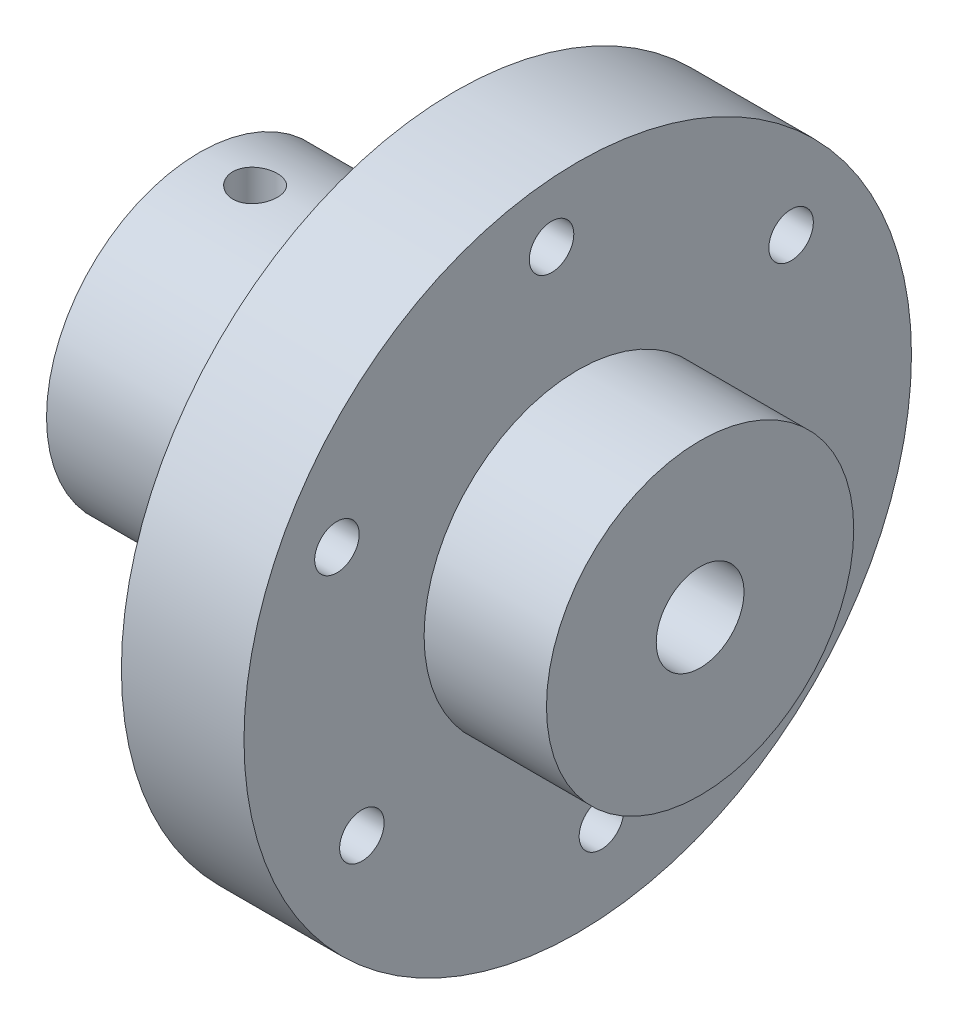
ISO-10303-21;
HEADER;
FILE_DESCRIPTION(('STEP AP214'),'2;1');
FILE_NAME('part.step','',(''),(''),'','','');
FILE_SCHEMA(('AUTOMOTIVE_DESIGN { 1 0 10303 214 1 1 1 1 }'));
ENDSEC;
DATA;
#1=APPLICATION_CONTEXT('core data for automotive mechanical design processes');
#2=APPLICATION_PROTOCOL_DEFINITION('international standard','automotive_design',2000,#1);
#3=PRODUCT_CONTEXT('',#1,'mechanical');
#4=PRODUCT('Part','Part','',(#3));
#5=PRODUCT_RELATED_PRODUCT_CATEGORY('part','',(#4));
#6=PRODUCT_DEFINITION_FORMATION('','',#4);
#7=PRODUCT_DEFINITION_CONTEXT('part definition',#1,'design');
#8=PRODUCT_DEFINITION('design','',#6,#7);
#9=PRODUCT_DEFINITION_SHAPE('','',#8);
#10=(LENGTH_UNIT() NAMED_UNIT(*) SI_UNIT(.MILLI.,.METRE.));
#11=(NAMED_UNIT(*) PLANE_ANGLE_UNIT() SI_UNIT($,.RADIAN.));
#12=(NAMED_UNIT(*) SI_UNIT($,.STERADIAN.) SOLID_ANGLE_UNIT());
#13=UNCERTAINTY_MEASURE_WITH_UNIT(LENGTH_MEASURE(1.E-05),#10,'distance_accuracy_value','');
#14=(GEOMETRIC_REPRESENTATION_CONTEXT(3) GLOBAL_UNCERTAINTY_ASSIGNED_CONTEXT((#13)) GLOBAL_UNIT_ASSIGNED_CONTEXT((#10,
#11,#12)) REPRESENTATION_CONTEXT('',''));
#15=CARTESIAN_POINT('',(0.,0.,0.));
#16=DIRECTION('',(0.,0.,1.));
#17=DIRECTION('',(1.,0.,0.));
#18=AXIS2_PLACEMENT_3D('',#15,#16,#17);
#19=CARTESIAN_POINT('',(0.,0.,0.));
#20=DIRECTION('',(1.,0.,0.));
#21=DIRECTION('',(0.,0.,-1.));
#22=AXIS2_PLACEMENT_3D('',#19,#20,#21);
#23=PLANE('',#22);
#24=CARTESIAN_POINT('',(0.,0.,0.));
#25=DIRECTION('',(1.,0.,0.));
#26=DIRECTION('',(0.,0.,-1.));
#27=AXIS2_PLACEMENT_3D('',#24,#25,#26);
#28=CIRCLE('',#27,13.75);
#29=CARTESIAN_POINT('',(0.,0.,-13.75));
#30=VERTEX_POINT('',#29);
#31=EDGE_CURVE('E168',#30,#30,#28,.T.);
#32=ORIENTED_EDGE('',*,*,#31,.F.);
#33=EDGE_LOOP('',(#32));
#34=FACE_BOUND('',#33,.T.);
#35=CARTESIAN_POINT('',(0.,0.,0.));
#36=DIRECTION('',(1.,0.,0.));
#37=DIRECTION('',(0.,0.,-1.));
#38=AXIS2_PLACEMENT_3D('',#35,#36,#37);
#39=CIRCLE('',#38,6.);
#40=CARTESIAN_POINT('',(0.,5.6479531690693,2.025));
#41=VERTEX_POINT('',#40);
#42=CARTESIAN_POINT('',(0.,5.6479531690693,-2.025));
#43=VERTEX_POINT('',#42);
#44=EDGE_CURVE('E165',#41,#43,#39,.T.);
#45=ORIENTED_EDGE('',*,*,#44,.T.);
#46=DIRECTION('',(0.,-1.,0.));
#47=VECTOR('',#46,1.);
#48=CARTESIAN_POINT('',(0.,3.85,-2.025));
#49=LINE('',#48,#47);
#50=CARTESIAN_POINT('',(0.,8.15,-2.025));
#51=VERTEX_POINT('',#50);
#52=EDGE_CURVE('E107',#51,#43,#49,.T.);
#53=ORIENTED_EDGE('',*,*,#52,.F.);
#54=DIRECTION('',(0.,0.,-1.));
#55=VECTOR('',#54,1.);
#56=CARTESIAN_POINT('',(0.,8.15,2.025));
#57=LINE('',#56,#55);
#58=CARTESIAN_POINT('',(0.,8.15,2.025));
#59=VERTEX_POINT('',#58);
#60=EDGE_CURVE('E111',#59,#51,#57,.T.);
#61=ORIENTED_EDGE('',*,*,#60,.F.);
#62=DIRECTION('',(0.,1.,0.));
#63=VECTOR('',#62,1.);
#64=CARTESIAN_POINT('',(0.,3.85,2.025));
#65=LINE('',#64,#63);
#66=EDGE_CURVE('E97',#41,#59,#65,.T.);
#67=ORIENTED_EDGE('',*,*,#66,.F.);
#68=EDGE_LOOP('',(#45,#53,#61,#67));
#69=FACE_BOUND('',#68,.T.);
#70=ADVANCED_FACE('F46',(#34,#69),#23,.F.);
#71=CARTESIAN_POINT('',(12.,0.,0.));
#72=DIRECTION('',(-1.,0.,0.));
#73=DIRECTION('',(0.,0.,1.));
#74=AXIS2_PLACEMENT_3D('',#71,#72,#73);
#75=CYLINDRICAL_SURFACE('',#74,13.75);
#76=CARTESIAN_POINT('',(5.,13.6037678604128,-1.99999999999999));
#77=CARTESIAN_POINT('',(5.11170147451788,13.6037696828469,-1.99999535765153));
#78=CARTESIAN_POINT('',(5.22346876317593,13.6051585235322,-1.99061045402892));
#79=CARTESIAN_POINT('',(5.44388126027463,13.610560390175,-1.9533271700691));
#80=CARTESIAN_POINT('',(5.55252327013628,13.614576011285,-1.92541048067569));
#81=CARTESIAN_POINT('',(5.76346273426917,13.6247672106777,-1.85191408162581));
#82=CARTESIAN_POINT('',(5.8657648809695,13.6309411684424,-1.80634762097099));
#83=CARTESIAN_POINT('',(6.06125576556668,13.6447514639797,-1.69887582800238));
#84=CARTESIAN_POINT('',(6.15444581428903,13.6523875909421,-1.63697285053975));
#85=CARTESIAN_POINT('',(6.32978470161016,13.6683261760088,-1.49808684531119));
#86=CARTESIAN_POINT('',(6.41185492507913,13.6766327766434,-1.42100503184549));
#87=CARTESIAN_POINT('',(6.56194363847952,13.692939341013,-1.25416264578909));
#88=CARTESIAN_POINT('',(6.62996137057535,13.7009392881916,-1.16440138984915));
#89=CARTESIAN_POINT('',(6.75030296803682,13.715774351691,-0.97424613739998));
#90=CARTESIAN_POINT('',(6.80255465914858,13.7226040510381,-0.873806006100216));
#91=CARTESIAN_POINT('',(6.88941795276066,13.7342832774787,-0.665459478823007));
#92=CARTESIAN_POINT('',(6.92403043291188,13.7391329030898,-0.557553454619606));
#93=CARTESIAN_POINT('',(6.97439507307044,13.7462763438899,-0.338146948151333));
#94=CARTESIAN_POINT('',(6.99027872984306,13.7485879705999,-0.226677240162861));
#95=CARTESIAN_POINT('',(7.00314299966664,13.7504559602361,-0.00263235495397235));
#96=CARTESIAN_POINT('',(7.00012460375964,13.7500124676143,0.109942764000325));
#97=CARTESIAN_POINT('',(6.97537453464449,13.7464344541793,0.332106213349457));
#98=CARTESIAN_POINT('',(6.95378432135685,13.7433202762861,0.441710677114486));
#99=CARTESIAN_POINT('',(6.89272535268884,13.7347734835498,0.655724208207438));
#100=CARTESIAN_POINT('',(6.85325615970269,13.7293408119595,0.760133148300332));
#101=CARTESIAN_POINT('',(6.75741371072513,13.7167324401517,0.961221913555114));
#102=CARTESIAN_POINT('',(6.70098057923809,13.7095505833803,1.05787279927888));
#103=CARTESIAN_POINT('',(6.57285586457755,13.6942448666419,1.24038631129748));
#104=CARTESIAN_POINT('',(6.5011633361525,13.6861209483325,1.3262482687421));
#105=CARTESIAN_POINT('',(6.34376603137261,13.6697490406875,1.48557995150401));
#106=CARTESIAN_POINT('',(6.25793778872673,13.6615005987712,1.55892771622801));
#107=CARTESIAN_POINT('',(6.07512578282357,13.6458827551655,1.69019745389173));
#108=CARTESIAN_POINT('',(5.97814195841379,13.6385133582954,1.74811934226432));
#109=CARTESIAN_POINT('',(5.77564828997558,13.6254881867745,1.84690774655302));
#110=CARTESIAN_POINT('',(5.67013251177874,13.6198336180394,1.88776226780074));
#111=CARTESIAN_POINT('',(5.4536366654301,13.6109000699534,1.95113638111024));
#112=CARTESIAN_POINT('',(5.34265695881667,13.6076209336494,1.97365718455691));
#113=CARTESIAN_POINT('',(5.11946711009801,13.6038391074986,1.99955843933568));
#114=CARTESIAN_POINT('',(5.00727741254296,13.6033113756213,2.00311153325653));
#115=CARTESIAN_POINT('',(4.78390419456717,13.605025676654,1.99143410784289));
#116=CARTESIAN_POINT('',(4.6727206449459,13.6072676289206,1.97620413540481));
#117=CARTESIAN_POINT('',(4.45504724747672,13.6142457139645,1.92753912095452));
#118=CARTESIAN_POINT('',(4.34853786703675,13.6189701240093,1.89418961854082));
#119=CARTESIAN_POINT('',(4.14262119152552,13.6303711708037,1.81032101224159));
#120=CARTESIAN_POINT('',(4.04321422810544,13.6370478986438,1.75980110720817));
#121=CARTESIAN_POINT('',(3.85354887459304,13.6516604770362,1.64260909382075));
#122=CARTESIAN_POINT('',(3.76336038729032,13.6596049238185,1.57582494389196));
#123=CARTESIAN_POINT('',(3.59540964992341,13.6758317056166,1.42815646147857));
#124=CARTESIAN_POINT('',(3.51764805972212,13.6841140585458,1.3472713807171));
#125=CARTESIAN_POINT('',(3.37614110931465,13.7001614515876,1.1729379394311));
#126=CARTESIAN_POINT('',(3.31250997540891,13.7079219456001,1.07939638120609));
#127=CARTESIAN_POINT('',(3.2018649493579,13.7219811196637,0.88285177714745));
#128=CARTESIAN_POINT('',(3.15485062496657,13.728279837738,0.779848977512918));
#129=CARTESIAN_POINT('',(3.07895749320421,13.7386857998428,0.567666837304545));
#130=CARTESIAN_POINT('',(3.05001554129796,13.742800666558,0.458510471781471));
#131=CARTESIAN_POINT('',(3.01088413075408,13.7484072260598,0.236822978136382));
#132=CARTESIAN_POINT('',(3.00069351066479,13.7498990813147,0.124292059471958));
#133=CARTESIAN_POINT('',(2.99938108993855,13.750090067362,-0.0998409077402447));
#134=CARTESIAN_POINT('',(3.00808425562929,13.7488148327678,-0.211441949207724));
#135=CARTESIAN_POINT('',(3.04393804943317,13.7436664644928,-0.43157602898444));
#136=CARTESIAN_POINT('',(3.07108862859001,13.7397933377064,-0.540109075434817));
#137=CARTESIAN_POINT('',(3.14300579441946,13.729882325212,-0.750983084659951));
#138=CARTESIAN_POINT('',(3.18776097767431,13.7238458410478,-0.853328006392702));
#139=CARTESIAN_POINT('',(3.29359839880605,13.7102721845597,-1.04908313807523));
#140=CARTESIAN_POINT('',(3.35468110272393,13.7027349694016,-1.14249309288839));
#141=CARTESIAN_POINT('',(3.49207556407473,13.6869153274344,-1.31861589391601));
#142=CARTESIAN_POINT('',(3.56851678883439,13.6786269185731,-1.40122721328146));
#143=CARTESIAN_POINT('',(3.73418621462435,13.6622840226442,-1.55251429750272));
#144=CARTESIAN_POINT('',(3.82341741628073,13.6542295910041,-1.62118678304169));
#145=CARTESIAN_POINT('',(4.01268413794728,13.6392212044936,-1.74296896599118));
#146=CARTESIAN_POINT('',(4.11277405500097,13.6322732651998,-1.79599484512113));
#147=CARTESIAN_POINT('',(4.32049135629694,13.6203350006855,-1.8844049661145));
#148=CARTESIAN_POINT('',(4.4281107090953,13.6153426259364,-1.91980768851834));
#149=CARTESIAN_POINT('',(4.61352373508644,13.6090457382165,-1.96384515631822));
#150=CARTESIAN_POINT('',(4.69016709723434,13.6070769015305,-1.97738272598922));
#151=CARTESIAN_POINT('',(4.84452968570156,13.604437336021,-1.99546171045602));
#152=CARTESIAN_POINT('',(4.92224889932033,13.6037665918865,-2.00000323136022));
#153=CARTESIAN_POINT('',(5.,13.6037678604128,-1.99999999999999));
#154=B_SPLINE_CURVE_WITH_KNOTS('',3,(#76,#77,#78,#79,#80,#81,#82,#83,#84,#85,#86,#87,#88,#89,
#90,#91,#92,#93,#94,#95,#96,#97,#98,#99,#100,#101,#102,#103,#104,#105,#106,#107,#108,#109,#110,
#111,#112,#113,#114,#115,#116,#117,#118,#119,#120,#121,#122,#123,#124,#125,#126,#127,#128,#129,
#130,#131,#132,#133,#134,#135,#136,#137,#138,#139,#140,#141,#142,#143,#144,#145,#146,#147,#148,
#149,#150,#151,#152,#153),.UNSPECIFIED.,.T.,.F.,(4,2,2,2,2,2,2,2,2,2,2,2,2,2,2,2,2,2,2,2,2,2,2,
2,2,2,2,2,2,2,2,2,2,2,2,2,2,2,4),(0.,0.334820265461425,0.669971820365651,1.0048722759916,
1.33972448324323,1.67683261336208,2.01395891861318,2.35260589974261,2.69123602961625,
3.02747417523753,3.36369469190864,3.69737669670612,4.03106686914349,4.36594893825537,
4.70085175785742,5.03885209035524,5.3768542757868,5.71509360567117,6.05331058486369,
6.3884438245952,6.72356730666316,7.05712229576474,7.39069285023051,7.72662975962056,
8.06258450119352,8.40116341082852,8.7397335125052,9.07711393835331,9.4144734662594,
9.74872101259892,10.0829676719057,10.4169981778597,10.7510382191581,11.0880221059806,
11.4250851815885,11.7639224096614,12.102403563257,12.3354618227143,12.5685173332333),.UNSPECIFIED.);
#155=CARTESIAN_POINT('',(5.,13.6037678604128,-1.99999999999999));
#156=VERTEX_POINT('',#155);
#157=EDGE_CURVE('E109',#156,#156,#154,.T.);
#158=ORIENTED_EDGE('',*,*,#157,.T.);
#159=EDGE_LOOP('',(#158));
#160=FACE_BOUND('',#159,.T.);
#161=ORIENTED_EDGE('',*,*,#31,.T.);
#162=EDGE_LOOP('',(#161));
#163=FACE_BOUND('',#162,.T.);
#164=CARTESIAN_POINT('',(22.98,0.,0.));
#165=DIRECTION('',(1.,0.,0.));
#166=DIRECTION('',(0.,0.,-1.));
#167=AXIS2_PLACEMENT_3D('',#164,#165,#166);
#168=CIRCLE('',#167,13.75);
#169=CARTESIAN_POINT('',(22.98,0.,-13.75));
#170=VERTEX_POINT('',#169);
#171=EDGE_CURVE('E156',#170,#170,#168,.T.);
#172=ORIENTED_EDGE('',*,*,#171,.F.);
#173=EDGE_LOOP('',(#172));
#174=FACE_BOUND('',#173,.T.);
#175=ADVANCED_FACE('F48',(#160,#163,#174),#75,.T.);
#176=CARTESIAN_POINT('',(12.,0.,0.));
#177=DIRECTION('',(-1.,0.,0.));
#178=DIRECTION('',(0.,0.,1.));
#179=AXIS2_PLACEMENT_3D('',#176,#177,#178);
#180=CYLINDRICAL_SURFACE('',#179,6.);
#181=DIRECTION('',(-1.,0.,0.));
#182=VECTOR('',#181,1.);
#183=CARTESIAN_POINT('',(12.,5.6479531690693,-2.025));
#184=LINE('',#183,#182);
#185=CARTESIAN_POINT('',(10.,5.6479531690693,-2.025));
#186=VERTEX_POINT('',#185);
#187=EDGE_CURVE('E55',#43,#186,#184,.F.);
#188=ORIENTED_EDGE('',*,*,#187,.F.);
#189=ORIENTED_EDGE('',*,*,#44,.F.);
#190=DIRECTION('',(-1.,0.,0.));
#191=VECTOR('',#190,1.);
#192=CARTESIAN_POINT('',(12.,5.6479531690693,2.025));
#193=LINE('',#192,#191);
#194=CARTESIAN_POINT('',(10.,5.6479531690693,2.025));
#195=VERTEX_POINT('',#194);
#196=EDGE_CURVE('E172',#195,#41,#193,.T.);
#197=ORIENTED_EDGE('',*,*,#196,.F.);
#198=CARTESIAN_POINT('',(10.,0.,0.));
#199=DIRECTION('',(-1.,0.,0.));
#200=DIRECTION('',(0.,0.,1.));
#201=AXIS2_PLACEMENT_3D('',#198,#199,#200);
#202=CIRCLE('',#201,6.);
#203=EDGE_CURVE('E67',#195,#186,#202,.T.);
#204=ORIENTED_EDGE('',*,*,#203,.T.);
#205=EDGE_LOOP('',(#188,#189,#197,#204));
#206=FACE_BOUND('',#205,.T.);
#207=CARTESIAN_POINT('',(12.,0.,0.));
#208=DIRECTION('',(1.,0.,0.));
#209=DIRECTION('',(0.,0.,-1.));
#210=AXIS2_PLACEMENT_3D('',#207,#208,#209);
#211=CIRCLE('',#210,6.);
#212=CARTESIAN_POINT('',(12.,0.,-6.));
#213=VERTEX_POINT('',#212);
#214=EDGE_CURVE('E162',#213,#213,#211,.T.);
#215=ORIENTED_EDGE('',*,*,#214,.T.);
#216=EDGE_LOOP('',(#215));
#217=FACE_BOUND('',#216,.T.);
#218=ADVANCED_FACE('F239',(#206,#217),#180,.F.);
#219=CARTESIAN_POINT('',(12.,0.,0.));
#220=DIRECTION('',(1.,0.,0.));
#221=DIRECTION('',(0.,0.,-1.));
#222=AXIS2_PLACEMENT_3D('',#219,#220,#221);
#223=PLANE('',#222);
#224=CARTESIAN_POINT('',(12.,0.,0.));
#225=DIRECTION('',(1.,0.,0.));
#226=DIRECTION('',(0.,0.,-1.));
#227=AXIS2_PLACEMENT_3D('',#224,#225,#226);
#228=CIRCLE('',#227,4.01);
#229=CARTESIAN_POINT('',(12.,0.,-4.01));
#230=VERTEX_POINT('',#229);
#231=EDGE_CURVE('E159',#230,#230,#228,.T.);
#232=ORIENTED_EDGE('',*,*,#231,.T.);
#233=EDGE_LOOP('',(#232));
#234=FACE_BOUND('',#233,.T.);
#235=ORIENTED_EDGE('',*,*,#214,.F.);
#236=EDGE_LOOP('',(#235));
#237=FACE_BOUND('',#236,.T.);
#238=ADVANCED_FACE('F236',(#234,#237),#223,.F.);
#239=CARTESIAN_POINT('',(61.8708729652601,0.,0.));
#240=DIRECTION('',(-1.,0.,0.));
#241=DIRECTION('',(0.,0.,1.));
#242=AXIS2_PLACEMENT_3D('',#239,#240,#241);
#243=CYLINDRICAL_SURFACE('',#242,4.01);
#244=ORIENTED_EDGE('',*,*,#231,.F.);
#245=EDGE_LOOP('',(#244));
#246=FACE_BOUND('',#245,.T.);
#247=CARTESIAN_POINT('',(34.,0.,0.));
#248=DIRECTION('',(1.,0.,0.));
#249=DIRECTION('',(0.,0.,-1.));
#250=AXIS2_PLACEMENT_3D('',#247,#248,#249);
#251=CIRCLE('',#250,4.01);
#252=CARTESIAN_POINT('',(34.,0.,-4.00999999999999));
#253=VERTEX_POINT('',#252);
#254=EDGE_CURVE('E261',#253,#253,#251,.T.);
#255=ORIENTED_EDGE('',*,*,#254,.T.);
#256=EDGE_LOOP('',(#255));
#257=FACE_BOUND('',#256,.T.);
#258=ADVANCED_FACE('F231',(#246,#257),#243,.F.);
#259=CARTESIAN_POINT('',(22.98,0.,0.));
#260=DIRECTION('',(1.,0.,0.));
#261=DIRECTION('',(0.,0.,-1.));
#262=AXIS2_PLACEMENT_3D('',#259,#260,#261);
#263=PLANE('',#262);
#264=CARTESIAN_POINT('',(22.98,10.843162234399,21.6436703131126));
#265=DIRECTION('',(1.,0.,0.));
#266=DIRECTION('',(0.,0.,-1.));
#267=AXIS2_PLACEMENT_3D('',#264,#265,#266);
#268=CIRCLE('',#267,1.99999999999999);
#269=CARTESIAN_POINT('',(22.98,10.843162234399,19.6436703131126));
#270=VERTEX_POINT('',#269);
#271=EDGE_CURVE('E117',#270,#270,#268,.T.);
#272=ORIENTED_EDGE('',*,*,#271,.T.);
#273=EDGE_LOOP('',(#272));
#274=FACE_BOUND('',#273,.T.);
#275=CARTESIAN_POINT('',(22.98,24.5683812365847,2.35315481087573));
#276=DIRECTION('',(1.,0.,0.));
#277=DIRECTION('',(0.,0.,-1.));
#278=AXIS2_PLACEMENT_3D('',#275,#276,#277);
#279=CIRCLE('',#278,1.99999999999999);
#280=CARTESIAN_POINT('',(22.98,24.5683812365847,0.353154810875743));
#281=VERTEX_POINT('',#280);
#282=EDGE_CURVE('E123',#281,#281,#279,.T.);
#283=ORIENTED_EDGE('',*,*,#282,.T.);
#284=EDGE_LOOP('',(#283));
#285=FACE_BOUND('',#284,.T.);
#286=CARTESIAN_POINT('',(22.98,14.724914260643,-19.1784912686404));
#287=DIRECTION('',(1.,0.,0.));
#288=DIRECTION('',(0.,0.,-1.));
#289=AXIS2_PLACEMENT_3D('',#286,#287,#288);
#290=CIRCLE('',#289,1.99999999999999);
#291=CARTESIAN_POINT('',(22.98,14.724914260643,-21.1784912686404));
#292=VERTEX_POINT('',#291);
#293=EDGE_CURVE('E129',#292,#292,#290,.T.);
#294=ORIENTED_EDGE('',*,*,#293,.T.);
#295=EDGE_LOOP('',(#294));
#296=FACE_BOUND('',#295,.T.);
#297=CARTESIAN_POINT('',(22.98,-8.84377171748452,-21.4196218459198));
#298=DIRECTION('',(1.,0.,0.));
#299=DIRECTION('',(0.,0.,-1.));
#300=AXIS2_PLACEMENT_3D('',#297,#298,#299);
#301=CIRCLE('',#300,1.99999999999999);
#302=CARTESIAN_POINT('',(22.98,-8.84377171748452,-23.4196218459198));
#303=VERTEX_POINT('',#302);
#304=EDGE_CURVE('E135',#303,#303,#301,.T.);
#305=ORIENTED_EDGE('',*,*,#304,.T.);
#306=EDGE_LOOP('',(#305));
#307=FACE_BOUND('',#306,.T.);
#308=CARTESIAN_POINT('',(22.98,-12.7255237437285,19.4025397358332));
#309=DIRECTION('',(1.,0.,0.));
#310=DIRECTION('',(0.,0.,-1.));
#311=AXIS2_PLACEMENT_3D('',#308,#309,#310);
#312=CIRCLE('',#311,1.99999999999999);
#313=CARTESIAN_POINT('',(22.98,-12.7255237437285,17.4025397358332));
#314=VERTEX_POINT('',#313);
#315=EDGE_CURVE('E141',#314,#314,#312,.T.);
#316=ORIENTED_EDGE('',*,*,#315,.T.);
#317=EDGE_LOOP('',(#316));
#318=FACE_BOUND('',#317,.T.);
#319=CARTESIAN_POINT('',(22.98,-22.5689907196703,-2.12910634368297));
#320=DIRECTION('',(1.,0.,0.));
#321=DIRECTION('',(0.,0.,-1.));
#322=AXIS2_PLACEMENT_3D('',#319,#320,#321);
#323=CIRCLE('',#322,1.99999999999999);
#324=CARTESIAN_POINT('',(22.98,-22.5689907196703,-4.12910634368296));
#325=VERTEX_POINT('',#324);
#326=EDGE_CURVE('E147',#325,#325,#323,.T.);
#327=ORIENTED_EDGE('',*,*,#326,.T.);
#328=EDGE_LOOP('',(#327));
#329=FACE_BOUND('',#328,.T.);
#330=ORIENTED_EDGE('',*,*,#171,.T.);
#331=EDGE_LOOP('',(#330));
#332=FACE_BOUND('',#331,.T.);
#333=CARTESIAN_POINT('',(22.98,0.,0.));
#334=DIRECTION('',(1.,0.,0.));
#335=DIRECTION('',(0.,0.,-1.));
#336=AXIS2_PLACEMENT_3D('',#333,#334,#335);
#337=CIRCLE('',#336,30.);
#338=CARTESIAN_POINT('',(22.98,0.,-30.));
#339=VERTEX_POINT('',#338);
#340=EDGE_CURVE('E150',#339,#339,#337,.T.);
#341=ORIENTED_EDGE('',*,*,#340,.F.);
#342=EDGE_LOOP('',(#341));
#343=FACE_BOUND('',#342,.T.);
#344=ADVANCED_FACE('F228',(#274,#285,#296,#307,#318,#329,#332,#343),#263,.F.);
#345=CARTESIAN_POINT('',(118.852813742386,0.,0.));
#346=DIRECTION('',(-1.,0.,0.));
#347=DIRECTION('',(0.,0.,1.));
#348=AXIS2_PLACEMENT_3D('',#345,#346,#347);
#349=CYLINDRICAL_SURFACE('',#348,30.);
#350=CARTESIAN_POINT('',(34.,0.,0.));
#351=DIRECTION('',(-1.,0.,0.));
#352=DIRECTION('',(0.,0.,1.));
#353=AXIS2_PLACEMENT_3D('',#350,#351,#352);
#354=CIRCLE('',#353,30.);
#355=CARTESIAN_POINT('',(34.,0.,30.));
#356=VERTEX_POINT('',#355);
#357=EDGE_CURVE('E153',#356,#356,#354,.T.);
#358=ORIENTED_EDGE('',*,*,#357,.T.);
#359=EDGE_LOOP('',(#358));
#360=FACE_BOUND('',#359,.T.);
#361=ORIENTED_EDGE('',*,*,#340,.T.);
#362=EDGE_LOOP('',(#361));
#363=FACE_BOUND('',#362,.T.);
#364=ADVANCED_FACE('F226',(#360,#363),#349,.T.);
#365=CARTESIAN_POINT('',(34.,0.0564500646122873,0.0223316793432973));
#366=DIRECTION('',(-1.,0.,0.));
#367=DIRECTION('',(0.,0.808292871444823,0.588780633149124));
#368=AXIS2_PLACEMENT_3D('',#365,#366,#367);
#369=PLANE('',#368);
#370=CARTESIAN_POINT('',(34.,0.,0.));
#371=DIRECTION('',(-1.,0.,0.));
#372=DIRECTION('',(0.,0.,1.));
#373=AXIS2_PLACEMENT_3D('',#370,#371,#372);
#374=CIRCLE('',#373,13.8107067846046);
#375=CARTESIAN_POINT('',(34.,0.,13.8107067846046));
#376=VERTEX_POINT('',#375);
#377=EDGE_CURVE('E13',#376,#376,#374,.F.);
#378=ORIENTED_EDGE('',*,*,#377,.F.);
#379=EDGE_LOOP('',(#378));
#380=FACE_BOUND('',#379,.T.);
#381=CARTESIAN_POINT('',(34.,10.843162234399,21.6436703131126));
#382=DIRECTION('',(1.,0.,0.));
#383=DIRECTION('',(0.,0.,-1.));
#384=AXIS2_PLACEMENT_3D('',#381,#382,#383);
#385=CIRCLE('',#384,1.99999999999999);
#386=CARTESIAN_POINT('',(34.,10.843162234399,19.6436703131126));
#387=VERTEX_POINT('',#386);
#388=EDGE_CURVE('E113',#387,#387,#385,.T.);
#389=ORIENTED_EDGE('',*,*,#388,.F.);
#390=EDGE_LOOP('',(#389));
#391=FACE_BOUND('',#390,.T.);
#392=CARTESIAN_POINT('',(34.,24.5683812365847,2.35315481087574));
#393=DIRECTION('',(1.,0.,0.));
#394=DIRECTION('',(0.,0.,-1.));
#395=AXIS2_PLACEMENT_3D('',#392,#393,#394);
#396=CIRCLE('',#395,1.99999999999999);
#397=CARTESIAN_POINT('',(34.,24.5683812365847,0.353154810875747));
#398=VERTEX_POINT('',#397);
#399=EDGE_CURVE('E120',#398,#398,#396,.T.);
#400=ORIENTED_EDGE('',*,*,#399,.F.);
#401=EDGE_LOOP('',(#400));
#402=FACE_BOUND('',#401,.T.);
#403=CARTESIAN_POINT('',(34.,14.724914260643,-19.1784912686404));
#404=DIRECTION('',(1.,0.,0.));
#405=DIRECTION('',(0.,0.,-1.));
#406=AXIS2_PLACEMENT_3D('',#403,#404,#405);
#407=CIRCLE('',#406,1.99999999999999);
#408=CARTESIAN_POINT('',(34.,14.724914260643,-21.1784912686404));
#409=VERTEX_POINT('',#408);
#410=EDGE_CURVE('E126',#409,#409,#407,.T.);
#411=ORIENTED_EDGE('',*,*,#410,.F.);
#412=EDGE_LOOP('',(#411));
#413=FACE_BOUND('',#412,.T.);
#414=CARTESIAN_POINT('',(34.,-8.84377171748452,-21.4196218459198));
#415=DIRECTION('',(1.,0.,0.));
#416=DIRECTION('',(0.,0.,-1.));
#417=AXIS2_PLACEMENT_3D('',#414,#415,#416);
#418=CIRCLE('',#417,1.99999999999999);
#419=CARTESIAN_POINT('',(34.,-8.84377171748452,-23.4196218459198));
#420=VERTEX_POINT('',#419);
#421=EDGE_CURVE('E132',#420,#420,#418,.T.);
#422=ORIENTED_EDGE('',*,*,#421,.F.);
#423=EDGE_LOOP('',(#422));
#424=FACE_BOUND('',#423,.T.);
#425=CARTESIAN_POINT('',(34.,-12.7255237437285,19.4025397358332));
#426=DIRECTION('',(1.,0.,0.));
#427=DIRECTION('',(0.,0.,-1.));
#428=AXIS2_PLACEMENT_3D('',#425,#426,#427);
#429=CIRCLE('',#428,1.99999999999999);
#430=CARTESIAN_POINT('',(34.,-12.7255237437285,17.4025397358332));
#431=VERTEX_POINT('',#430);
#432=EDGE_CURVE('E138',#431,#431,#429,.T.);
#433=ORIENTED_EDGE('',*,*,#432,.F.);
#434=EDGE_LOOP('',(#433));
#435=FACE_BOUND('',#434,.T.);
#436=CARTESIAN_POINT('',(34.,-22.5689907196703,-2.12910634368296));
#437=DIRECTION('',(1.,0.,0.));
#438=DIRECTION('',(0.,0.,-1.));
#439=AXIS2_PLACEMENT_3D('',#436,#437,#438);
#440=CIRCLE('',#439,1.99999999999999);
#441=CARTESIAN_POINT('',(34.,-22.5689907196703,-4.12910634368295));
#442=VERTEX_POINT('',#441);
#443=EDGE_CURVE('E144',#442,#442,#440,.T.);
#444=ORIENTED_EDGE('',*,*,#443,.F.);
#445=EDGE_LOOP('',(#444));
#446=FACE_BOUND('',#445,.T.);
#447=ORIENTED_EDGE('',*,*,#357,.F.);
#448=EDGE_LOOP('',(#447));
#449=FACE_BOUND('',#448,.T.);
#450=ADVANCED_FACE('F222',(#380,#391,#402,#413,#424,#435,#446,#449),#369,.F.);
#451=CARTESIAN_POINT('',(34.,-22.5689907196703,-2.12910634368296));
#452=DIRECTION('',(1.,0.,0.));
#453=DIRECTION('',(0.,0.,-1.));
#454=AXIS2_PLACEMENT_3D('',#451,#452,#453);
#455=CYLINDRICAL_SURFACE('',#454,1.99999999999999);
#456=ORIENTED_EDGE('',*,*,#443,.T.);
#457=EDGE_LOOP('',(#456));
#458=FACE_BOUND('',#457,.T.);
#459=ORIENTED_EDGE('',*,*,#326,.F.);
#460=EDGE_LOOP('',(#459));
#461=FACE_BOUND('',#460,.T.);
#462=ADVANCED_FACE('F218',(#458,#461),#455,.F.);
#463=CARTESIAN_POINT('',(34.,-12.7255237437285,19.4025397358332));
#464=DIRECTION('',(1.,0.,0.));
#465=DIRECTION('',(0.,0.,-1.));
#466=AXIS2_PLACEMENT_3D('',#463,#464,#465);
#467=CYLINDRICAL_SURFACE('',#466,1.99999999999999);
#468=ORIENTED_EDGE('',*,*,#432,.T.);
#469=EDGE_LOOP('',(#468));
#470=FACE_BOUND('',#469,.T.);
#471=ORIENTED_EDGE('',*,*,#315,.F.);
#472=EDGE_LOOP('',(#471));
#473=FACE_BOUND('',#472,.T.);
#474=ADVANCED_FACE('F214',(#470,#473),#467,.F.);
#475=CARTESIAN_POINT('',(34.,-8.84377171748452,-21.4196218459198));
#476=DIRECTION('',(1.,0.,0.));
#477=DIRECTION('',(0.,0.,-1.));
#478=AXIS2_PLACEMENT_3D('',#475,#476,#477);
#479=CYLINDRICAL_SURFACE('',#478,1.99999999999999);
#480=ORIENTED_EDGE('',*,*,#421,.T.);
#481=EDGE_LOOP('',(#480));
#482=FACE_BOUND('',#481,.T.);
#483=ORIENTED_EDGE('',*,*,#304,.F.);
#484=EDGE_LOOP('',(#483));
#485=FACE_BOUND('',#484,.T.);
#486=ADVANCED_FACE('F210',(#482,#485),#479,.F.);
#487=CARTESIAN_POINT('',(34.,14.724914260643,-19.1784912686404));
#488=DIRECTION('',(1.,0.,0.));
#489=DIRECTION('',(0.,0.,-1.));
#490=AXIS2_PLACEMENT_3D('',#487,#488,#489);
#491=CYLINDRICAL_SURFACE('',#490,1.99999999999999);
#492=ORIENTED_EDGE('',*,*,#410,.T.);
#493=EDGE_LOOP('',(#492));
#494=FACE_BOUND('',#493,.T.);
#495=ORIENTED_EDGE('',*,*,#293,.F.);
#496=EDGE_LOOP('',(#495));
#497=FACE_BOUND('',#496,.T.);
#498=ADVANCED_FACE('F206',(#494,#497),#491,.F.);
#499=CARTESIAN_POINT('',(34.,24.5683812365847,2.35315481087574));
#500=DIRECTION('',(1.,0.,0.));
#501=DIRECTION('',(0.,0.,-1.));
#502=AXIS2_PLACEMENT_3D('',#499,#500,#501);
#503=CYLINDRICAL_SURFACE('',#502,1.99999999999999);
#504=ORIENTED_EDGE('',*,*,#399,.T.);
#505=EDGE_LOOP('',(#504));
#506=FACE_BOUND('',#505,.T.);
#507=ORIENTED_EDGE('',*,*,#282,.F.);
#508=EDGE_LOOP('',(#507));
#509=FACE_BOUND('',#508,.T.);
#510=ADVANCED_FACE('F202',(#506,#509),#503,.F.);
#511=CARTESIAN_POINT('',(34.,10.843162234399,21.6436703131126));
#512=DIRECTION('',(1.,0.,0.));
#513=DIRECTION('',(0.,0.,-1.));
#514=AXIS2_PLACEMENT_3D('',#511,#512,#513);
#515=CYLINDRICAL_SURFACE('',#514,1.99999999999999);
#516=ORIENTED_EDGE('',*,*,#388,.T.);
#517=EDGE_LOOP('',(#516));
#518=FACE_BOUND('',#517,.T.);
#519=ORIENTED_EDGE('',*,*,#271,.F.);
#520=EDGE_LOOP('',(#519));
#521=FACE_BOUND('',#520,.T.);
#522=ADVANCED_FACE('F198',(#518,#521),#515,.F.);
#523=CARTESIAN_POINT('',(10.,3.85,-2.025));
#524=DIRECTION('',(0.,0.,-1.));
#525=DIRECTION('',(-1.,0.,0.));
#526=AXIS2_PLACEMENT_3D('',#523,#524,#525);
#527=PLANE('',#526);
#528=ORIENTED_EDGE('',*,*,#187,.T.);
#529=DIRECTION('',(0.,-1.,0.));
#530=VECTOR('',#529,1.);
#531=CARTESIAN_POINT('',(10.,3.85,-2.025));
#532=LINE('',#531,#530);
#533=CARTESIAN_POINT('',(10.,8.14999999999999,-2.025));
#534=VERTEX_POINT('',#533);
#535=EDGE_CURVE('E62',#534,#186,#532,.T.);
#536=ORIENTED_EDGE('',*,*,#535,.F.);
#537=DIRECTION('',(-1.,0.,0.));
#538=VECTOR('',#537,1.);
#539=CARTESIAN_POINT('',(10.,8.14999999999999,-2.025));
#540=LINE('',#539,#538);
#541=EDGE_CURVE('E101',#534,#51,#540,.T.);
#542=ORIENTED_EDGE('',*,*,#541,.T.);
#543=ORIENTED_EDGE('',*,*,#52,.T.);
#544=EDGE_LOOP('',(#528,#536,#542,#543));
#545=FACE_BOUND('',#544,.T.);
#546=ADVANCED_FACE('F192',(#545),#527,.F.);
#547=CARTESIAN_POINT('',(10.,8.14999999999999,2.025));
#548=DIRECTION('',(0.,1.,0.));
#549=DIRECTION('',(0.,0.,1.));
#550=AXIS2_PLACEMENT_3D('',#547,#548,#549);
#551=PLANE('',#550);
#552=CARTESIAN_POINT('',(5.,8.15,0.));
#553=DIRECTION('',(0.,-1.,0.));
#554=DIRECTION('',(0.,0.,-1.));
#555=AXIS2_PLACEMENT_3D('',#552,#553,#554);
#556=CIRCLE('',#555,1.99999999999999);
#557=CARTESIAN_POINT('',(5.,8.15,-1.99999999999999));
#558=VERTEX_POINT('',#557);
#559=EDGE_CURVE('E178',#558,#558,#556,.T.);
#560=ORIENTED_EDGE('',*,*,#559,.F.);
#561=EDGE_LOOP('',(#560));
#562=FACE_BOUND('',#561,.T.);
#563=ORIENTED_EDGE('',*,*,#60,.T.);
#564=ORIENTED_EDGE('',*,*,#541,.F.);
#565=DIRECTION('',(0.,0.,-1.));
#566=VECTOR('',#565,1.);
#567=CARTESIAN_POINT('',(10.,8.14999999999999,2.025));
#568=LINE('',#567,#566);
#569=CARTESIAN_POINT('',(10.,8.14999999999999,2.025));
#570=VERTEX_POINT('',#569);
#571=EDGE_CURVE('E89',#570,#534,#568,.T.);
#572=ORIENTED_EDGE('',*,*,#571,.F.);
#573=DIRECTION('',(-1.,0.,0.));
#574=VECTOR('',#573,1.);
#575=CARTESIAN_POINT('',(10.,8.14999999999999,2.025));
#576=LINE('',#575,#574);
#577=EDGE_CURVE('E94',#570,#59,#576,.T.);
#578=ORIENTED_EDGE('',*,*,#577,.T.);
#579=EDGE_LOOP('',(#563,#564,#572,#578));
#580=FACE_BOUND('',#579,.T.);
#581=ADVANCED_FACE('F103',(#562,#580),#551,.F.);
#582=CARTESIAN_POINT('',(10.,3.85,2.025));
#583=DIRECTION('',(0.,0.,1.));
#584=DIRECTION('',(1.,0.,0.));
#585=AXIS2_PLACEMENT_3D('',#582,#583,#584);
#586=PLANE('',#585);
#587=ORIENTED_EDGE('',*,*,#196,.T.);
#588=ORIENTED_EDGE('',*,*,#66,.T.);
#589=ORIENTED_EDGE('',*,*,#577,.F.);
#590=DIRECTION('',(0.,1.,0.));
#591=VECTOR('',#590,1.);
#592=CARTESIAN_POINT('',(10.,3.85,2.025));
#593=LINE('',#592,#591);
#594=EDGE_CURVE('E85',#195,#570,#593,.T.);
#595=ORIENTED_EDGE('',*,*,#594,.F.);
#596=EDGE_LOOP('',(#587,#588,#589,#595));
#597=FACE_BOUND('',#596,.T.);
#598=ADVANCED_FACE('F95',(#597),#586,.F.);
#599=CARTESIAN_POINT('',(10.,0.,0.));
#600=DIRECTION('',(-1.,0.,0.));
#601=DIRECTION('',(0.,0.,1.));
#602=AXIS2_PLACEMENT_3D('',#599,#600,#601);
#603=PLANE('',#602);
#604=ORIENTED_EDGE('',*,*,#594,.T.);
#605=ORIENTED_EDGE('',*,*,#571,.T.);
#606=ORIENTED_EDGE('',*,*,#535,.T.);
#607=ORIENTED_EDGE('',*,*,#203,.F.);
#608=EDGE_LOOP('',(#604,#605,#606,#607));
#609=FACE_BOUND('',#608,.T.);
#610=ADVANCED_FACE('F87',(#609),#603,.T.);
#611=CARTESIAN_POINT('',(5.,8.15,0.));
#612=DIRECTION('',(0.,-1.,0.));
#613=DIRECTION('',(0.,0.,-1.));
#614=AXIS2_PLACEMENT_3D('',#611,#612,#613);
#615=CYLINDRICAL_SURFACE('',#614,1.99999999999999);
#616=ORIENTED_EDGE('',*,*,#559,.T.);
#617=EDGE_LOOP('',(#616));
#618=FACE_BOUND('',#617,.T.);
#619=ORIENTED_EDGE('',*,*,#157,.F.);
#620=EDGE_LOOP('',(#619));
#621=FACE_BOUND('',#620,.T.);
#622=ADVANCED_FACE('F179',(#618,#621),#615,.F.);
#623=CARTESIAN_POINT('',(34.,0.,0.));
#624=DIRECTION('',(1.,0.,0.));
#625=DIRECTION('',(0.,0.,-1.));
#626=AXIS2_PLACEMENT_3D('',#623,#624,#625);
#627=PLANE('',#626);
#628=CARTESIAN_POINT('',(34.,0.0564500646122873,0.));
#629=DIRECTION('',(1.,0.,0.));
#630=DIRECTION('',(0.,0.,-1.));
#631=AXIS2_PLACEMENT_3D('',#628,#629,#630);
#632=CIRCLE('',#631,3.9435499353877);
#633=CARTESIAN_POINT('',(34.,0.0564500646123005,3.94354993538771));
#634=VERTEX_POINT('',#633);
#635=EDGE_CURVE('E270',#634,#634,#632,.T.);
#636=ORIENTED_EDGE('',*,*,#635,.T.);
#637=EDGE_LOOP('',(#636));
#638=FACE_BOUND('',#637,.T.);
#639=ORIENTED_EDGE('',*,*,#254,.F.);
#640=EDGE_LOOP('',(#639));
#641=FACE_BOUND('',#640,.T.);
#642=ADVANCED_FACE('F184',(#638,#641),#627,.F.);
#643=CARTESIAN_POINT('',(84.0625776814917,0.,0.));
#644=DIRECTION('',(-1.,0.,0.));
#645=DIRECTION('',(0.,0.,1.));
#646=AXIS2_PLACEMENT_3D('',#643,#644,#645);
#647=CYLINDRICAL_SURFACE('',#646,13.8107067846046);
#648=CARTESIAN_POINT('',(45.,0.,0.));
#649=DIRECTION('',(-1.,0.,0.));
#650=DIRECTION('',(0.,-1.,0.));
#651=AXIS2_PLACEMENT_3D('',#648,#649,#650);
#652=CIRCLE('',#651,13.8107067846046);
#653=CARTESIAN_POINT('',(45.,0.,13.8107067846046));
#654=VERTEX_POINT('',#653);
#655=EDGE_CURVE('E267',#654,#654,#652,.T.);
#656=CARTESIAN_POINT('',(45.,0.,13.8107067846046));
#657=CARTESIAN_POINT('',(44.8854166666666,0.,13.8107067846046));
#658=CARTESIAN_POINT('',(44.7708333333333,0.,13.8107067846046));
#659=CARTESIAN_POINT('',(44.5416666666666,0.,13.8107067846046));
#660=CARTESIAN_POINT('',(44.4270833333333,0.,13.8107067846046));
#661=CARTESIAN_POINT('',(44.1979166666666,0.,13.8107067846046));
#662=CARTESIAN_POINT('',(44.0833333333333,0.,13.8107067846046));
#663=CARTESIAN_POINT('',(43.8541666666666,0.,13.8107067846046));
#664=CARTESIAN_POINT('',(43.7395833333333,0.,13.8107067846046));
#665=CARTESIAN_POINT('',(43.5104166666666,0.,13.8107067846046));
#666=CARTESIAN_POINT('',(43.3958333333333,0.,13.8107067846046));
#667=CARTESIAN_POINT('',(43.1666666666666,0.,13.8107067846046));
#668=CARTESIAN_POINT('',(43.0520833333333,0.,13.8107067846046));
#669=CARTESIAN_POINT('',(42.8229166666666,0.,13.8107067846046));
#670=CARTESIAN_POINT('',(42.7083333333333,0.,13.8107067846046));
#671=CARTESIAN_POINT('',(42.4791666666666,0.,13.8107067846046));
#672=CARTESIAN_POINT('',(42.3645833333333,0.,13.8107067846046));
#673=CARTESIAN_POINT('',(42.1354166666666,0.,13.8107067846046));
#674=CARTESIAN_POINT('',(42.0208333333333,0.,13.8107067846046));
#675=CARTESIAN_POINT('',(41.7916666666666,0.,13.8107067846046));
#676=CARTESIAN_POINT('',(41.6770833333333,0.,13.8107067846046));
#677=CARTESIAN_POINT('',(41.4479166666667,0.,13.8107067846046));
#678=CARTESIAN_POINT('',(41.3333333333333,0.,13.8107067846046));
#679=CARTESIAN_POINT('',(41.1041666666666,0.,13.8107067846046));
#680=CARTESIAN_POINT('',(40.9895833333333,0.,13.8107067846046));
#681=CARTESIAN_POINT('',(40.7604166666666,0.,13.8107067846046));
#682=CARTESIAN_POINT('',(40.6458333333333,0.,13.8107067846046));
#683=CARTESIAN_POINT('',(40.4166666666666,0.,13.8107067846046));
#684=CARTESIAN_POINT('',(40.3020833333333,0.,13.8107067846046));
#685=CARTESIAN_POINT('',(40.0729166666666,0.,13.8107067846046));
#686=CARTESIAN_POINT('',(39.9583333333333,0.,13.8107067846046));
#687=CARTESIAN_POINT('',(39.7291666666666,0.,13.8107067846046));
#688=CARTESIAN_POINT('',(39.6145833333333,0.,13.8107067846046));
#689=CARTESIAN_POINT('',(39.3854166666666,0.,13.8107067846046));
#690=CARTESIAN_POINT('',(39.2708333333333,0.,13.8107067846046));
#691=CARTESIAN_POINT('',(39.0416666666667,0.,13.8107067846046));
#692=CARTESIAN_POINT('',(38.9270833333333,0.,13.8107067846046));
#693=CARTESIAN_POINT('',(38.6979166666666,0.,13.8107067846046));
#694=CARTESIAN_POINT('',(38.5833333333333,0.,13.8107067846046));
#695=CARTESIAN_POINT('',(38.3541666666667,0.,13.8107067846046));
#696=CARTESIAN_POINT('',(38.2395833333333,0.,13.8107067846046));
#697=CARTESIAN_POINT('',(38.0104166666666,0.,13.8107067846046));
#698=CARTESIAN_POINT('',(37.8958333333333,0.,13.8107067846046));
#699=CARTESIAN_POINT('',(37.6666666666667,0.,13.8107067846046));
#700=CARTESIAN_POINT('',(37.5520833333333,0.,13.8107067846046));
#701=CARTESIAN_POINT('',(37.3229166666666,0.,13.8107067846046));
#702=CARTESIAN_POINT('',(37.2083333333333,0.,13.8107067846046));
#703=CARTESIAN_POINT('',(36.9791666666666,0.,13.8107067846046));
#704=CARTESIAN_POINT('',(36.8645833333333,0.,13.8107067846046));
#705=CARTESIAN_POINT('',(36.6354166666667,0.,13.8107067846046));
#706=CARTESIAN_POINT('',(36.5208333333333,0.,13.8107067846046));
#707=CARTESIAN_POINT('',(36.2916666666666,0.,13.8107067846046));
#708=CARTESIAN_POINT('',(36.1770833333333,0.,13.8107067846046));
#709=CARTESIAN_POINT('',(35.9479166666666,0.,13.8107067846046));
#710=CARTESIAN_POINT('',(35.8333333333333,0.,13.8107067846046));
#711=CARTESIAN_POINT('',(35.6041666666666,0.,13.8107067846046));
#712=CARTESIAN_POINT('',(35.4895833333333,0.,13.8107067846046));
#713=CARTESIAN_POINT('',(35.2604166666667,0.,13.8107067846046));
#714=CARTESIAN_POINT('',(35.1458333333333,0.,13.8107067846046));
#715=CARTESIAN_POINT('',(34.9166666666666,0.,13.8107067846046));
#716=CARTESIAN_POINT('',(34.8020833333333,0.,13.8107067846046));
#717=CARTESIAN_POINT('',(34.5729166666667,0.,13.8107067846046));
#718=CARTESIAN_POINT('',(34.4583333333333,0.,13.8107067846046));
#719=CARTESIAN_POINT('',(34.2291666666667,0.,13.8107067846046));
#720=CARTESIAN_POINT('',(34.1145833333333,0.,13.8107067846046));
#721=CARTESIAN_POINT('',(34.,0.,13.8107067846046));
#722=B_SPLINE_CURVE_WITH_KNOTS('',3,(#656,#657,#658,#659,#660,#661,#662,#663,#664,#665,#666,
#667,#668,#669,#670,#671,#672,#673,#674,#675,#676,#677,#678,#679,#680,#681,#682,#683,#684,#685,
#686,#687,#688,#689,#690,#691,#692,#693,#694,#695,#696,#697,#698,#699,#700,#701,#702,#703,#704,
#705,#706,#707,#708,#709,#710,#711,#712,#713,#714,#715,#716,#717,#718,#719,#720,#721),
.UNSPECIFIED.,.F.,.F.,(4,2,2,2,2,2,2,2,2,2,2,2,2,2,2,2,2,2,2,2,2,2,2,2,2,2,2,2,2,2,2,2,4),(0.,
0.343749999999997,0.687500000000001,1.03125,1.375,1.71875,2.0625,2.40625,2.75,3.09375,3.4375,
3.78125,4.125,4.46875,4.8125,5.15625,5.5,5.84374999999999,6.1875,6.53125,6.875,7.21875,7.5625,
7.90625,8.24999999999999,8.59375,8.9375,9.28125,9.62499999999999,9.96875,10.3125,10.65625,11.),.UNSPECIFIED.);
#723=EDGE_CURVE('BSEAM278',#654,#376,#722,.T.);
#724=ORIENTED_EDGE('',*,*,#655,.T.);
#725=ORIENTED_EDGE('',*,*,#377,.T.);
#726=ORIENTED_EDGE('',*,*,#723,.T.);
#727=ORIENTED_EDGE('',*,*,#723,.F.);
#728=EDGE_LOOP('',(#724,#726,#725,#727));
#729=FACE_BOUND('',#728,.T.);
#730=ADVANCED_FACE('F278',(#729),#647,.T.);
#731=CARTESIAN_POINT('',(84.0625776814917,0.0564500646123012,0.));
#732=DIRECTION('',(-1.,0.,0.));
#733=DIRECTION('',(0.,0.,1.));
#734=AXIS2_PLACEMENT_3D('',#731,#732,#733);
#735=CYLINDRICAL_SURFACE('',#734,3.9435499353877);
#736=CARTESIAN_POINT('',(45.,0.0564500646122873,0.));
#737=DIRECTION('',(-1.,0.,0.));
#738=DIRECTION('',(0.,-1.,0.));
#739=AXIS2_PLACEMENT_3D('',#736,#737,#738);
#740=CIRCLE('',#739,3.9435499353877);
#741=CARTESIAN_POINT('',(45.,0.0564500646123006,3.94354993538771));
#742=VERTEX_POINT('',#741);
#743=EDGE_CURVE('E264',#742,#742,#740,.T.);
#744=CARTESIAN_POINT('',(45.,0.0564500646123006,3.94354993538771));
#745=CARTESIAN_POINT('',(44.8854166666666,0.0564500646123006,3.94354993538771));
#746=CARTESIAN_POINT('',(44.7708333333333,0.0564500646123006,3.94354993538771));
#747=CARTESIAN_POINT('',(44.5416666666666,0.0564500646123006,3.94354993538771));
#748=CARTESIAN_POINT('',(44.4270833333333,0.0564500646123006,3.94354993538771));
#749=CARTESIAN_POINT('',(44.1979166666666,0.0564500646123006,3.94354993538771));
#750=CARTESIAN_POINT('',(44.0833333333333,0.0564500646123006,3.94354993538771));
#751=CARTESIAN_POINT('',(43.8541666666666,0.0564500646123006,3.94354993538771));
#752=CARTESIAN_POINT('',(43.7395833333333,0.0564500646123006,3.94354993538771));
#753=CARTESIAN_POINT('',(43.5104166666666,0.0564500646123006,3.94354993538771));
#754=CARTESIAN_POINT('',(43.3958333333333,0.0564500646123006,3.94354993538771));
#755=CARTESIAN_POINT('',(43.1666666666666,0.0564500646123006,3.94354993538771));
#756=CARTESIAN_POINT('',(43.0520833333333,0.0564500646123006,3.94354993538771));
#757=CARTESIAN_POINT('',(42.8229166666666,0.0564500646123006,3.94354993538771));
#758=CARTESIAN_POINT('',(42.7083333333333,0.0564500646123006,3.94354993538771));
#759=CARTESIAN_POINT('',(42.4791666666666,0.0564500646123006,3.94354993538771));
#760=CARTESIAN_POINT('',(42.3645833333333,0.0564500646123006,3.94354993538771));
#761=CARTESIAN_POINT('',(42.1354166666666,0.0564500646123006,3.94354993538771));
#762=CARTESIAN_POINT('',(42.0208333333333,0.0564500646123006,3.94354993538771));
#763=CARTESIAN_POINT('',(41.7916666666666,0.0564500646123006,3.94354993538771));
#764=CARTESIAN_POINT('',(41.6770833333333,0.0564500646123006,3.94354993538771));
#765=CARTESIAN_POINT('',(41.4479166666667,0.0564500646123006,3.94354993538771));
#766=CARTESIAN_POINT('',(41.3333333333333,0.0564500646123006,3.94354993538771));
#767=CARTESIAN_POINT('',(41.1041666666666,0.0564500646123006,3.94354993538771));
#768=CARTESIAN_POINT('',(40.9895833333333,0.0564500646123006,3.94354993538771));
#769=CARTESIAN_POINT('',(40.7604166666666,0.0564500646123006,3.94354993538771));
#770=CARTESIAN_POINT('',(40.6458333333333,0.0564500646123006,3.94354993538771));
#771=CARTESIAN_POINT('',(40.4166666666666,0.0564500646123006,3.94354993538771));
#772=CARTESIAN_POINT('',(40.3020833333333,0.0564500646123006,3.94354993538771));
#773=CARTESIAN_POINT('',(40.0729166666666,0.0564500646123006,3.94354993538771));
#774=CARTESIAN_POINT('',(39.9583333333333,0.0564500646123006,3.94354993538771));
#775=CARTESIAN_POINT('',(39.7291666666666,0.0564500646123006,3.94354993538771));
#776=CARTESIAN_POINT('',(39.6145833333333,0.0564500646123006,3.94354993538771));
#777=CARTESIAN_POINT('',(39.3854166666666,0.0564500646123006,3.94354993538771));
#778=CARTESIAN_POINT('',(39.2708333333333,0.0564500646123006,3.94354993538771));
#779=CARTESIAN_POINT('',(39.0416666666667,0.0564500646123006,3.94354993538771));
#780=CARTESIAN_POINT('',(38.9270833333333,0.0564500646123006,3.94354993538771));
#781=CARTESIAN_POINT('',(38.6979166666666,0.0564500646123006,3.94354993538771));
#782=CARTESIAN_POINT('',(38.5833333333333,0.0564500646123005,3.94354993538771));
#783=CARTESIAN_POINT('',(38.3541666666667,0.0564500646123005,3.94354993538771));
#784=CARTESIAN_POINT('',(38.2395833333333,0.0564500646123005,3.94354993538771));
#785=CARTESIAN_POINT('',(38.0104166666666,0.0564500646123005,3.94354993538771));
#786=CARTESIAN_POINT('',(37.8958333333333,0.0564500646123005,3.94354993538771));
#787=CARTESIAN_POINT('',(37.6666666666667,0.0564500646123005,3.94354993538771));
#788=CARTESIAN_POINT('',(37.5520833333333,0.0564500646123005,3.94354993538771));
#789=CARTESIAN_POINT('',(37.3229166666666,0.0564500646123005,3.94354993538771));
#790=CARTESIAN_POINT('',(37.2083333333333,0.0564500646123005,3.94354993538771));
#791=CARTESIAN_POINT('',(36.9791666666666,0.0564500646123005,3.94354993538771));
#792=CARTESIAN_POINT('',(36.8645833333333,0.0564500646123005,3.94354993538771));
#793=CARTESIAN_POINT('',(36.6354166666667,0.0564500646123005,3.94354993538771));
#794=CARTESIAN_POINT('',(36.5208333333333,0.0564500646123005,3.94354993538771));
#795=CARTESIAN_POINT('',(36.2916666666666,0.0564500646123005,3.94354993538771));
#796=CARTESIAN_POINT('',(36.1770833333333,0.0564500646123005,3.94354993538771));
#797=CARTESIAN_POINT('',(35.9479166666666,0.0564500646123005,3.94354993538771));
#798=CARTESIAN_POINT('',(35.8333333333333,0.0564500646123005,3.94354993538771));
#799=CARTESIAN_POINT('',(35.6041666666666,0.0564500646123005,3.94354993538771));
#800=CARTESIAN_POINT('',(35.4895833333333,0.0564500646123005,3.94354993538771));
#801=CARTESIAN_POINT('',(35.2604166666667,0.0564500646123005,3.94354993538771));
#802=CARTESIAN_POINT('',(35.1458333333333,0.0564500646123005,3.94354993538771));
#803=CARTESIAN_POINT('',(34.9166666666666,0.0564500646123005,3.94354993538771));
#804=CARTESIAN_POINT('',(34.8020833333333,0.0564500646123005,3.94354993538771));
#805=CARTESIAN_POINT('',(34.5729166666667,0.0564500646123005,3.94354993538771));
#806=CARTESIAN_POINT('',(34.4583333333333,0.0564500646123005,3.94354993538771));
#807=CARTESIAN_POINT('',(34.2291666666667,0.0564500646123005,3.94354993538771));
#808=CARTESIAN_POINT('',(34.1145833333333,0.0564500646123005,3.94354993538771));
#809=CARTESIAN_POINT('',(34.,0.0564500646123005,3.94354993538771));
#810=B_SPLINE_CURVE_WITH_KNOTS('',3,(#744,#745,#746,#747,#748,#749,#750,#751,#752,#753,#754,
#755,#756,#757,#758,#759,#760,#761,#762,#763,#764,#765,#766,#767,#768,#769,#770,#771,#772,#773,
#774,#775,#776,#777,#778,#779,#780,#781,#782,#783,#784,#785,#786,#787,#788,#789,#790,#791,#792,
#793,#794,#795,#796,#797,#798,#799,#800,#801,#802,#803,#804,#805,#806,#807,#808,#809),
.UNSPECIFIED.,.F.,.F.,(4,2,2,2,2,2,2,2,2,2,2,2,2,2,2,2,2,2,2,2,2,2,2,2,2,2,2,2,2,2,2,2,4),(0.,
0.343749999999997,0.687500000000001,1.03125,1.375,1.71875,2.0625,2.40625,2.75,3.09375,3.4375,
3.78125,4.125,4.46875,4.8125,5.15625,5.5,5.84374999999999,6.1875,6.53125,6.875,7.21875,7.5625,
7.90625,8.24999999999999,8.59375,8.9375,9.28125,9.62499999999999,9.96875,10.3125,10.65625,11.),.UNSPECIFIED.);
#811=EDGE_CURVE('BSEAM276',#742,#634,#810,.T.);
#812=ORIENTED_EDGE('',*,*,#743,.F.);
#813=ORIENTED_EDGE('',*,*,#635,.F.);
#814=ORIENTED_EDGE('',*,*,#811,.T.);
#815=ORIENTED_EDGE('',*,*,#811,.F.);
#816=EDGE_LOOP('',(#812,#814,#813,#815));
#817=FACE_BOUND('',#816,.T.);
#818=ADVANCED_FACE('F276',(#817),#735,.F.);
#819=CARTESIAN_POINT('',(45.,3.99999999999999,0.));
#820=DIRECTION('',(-1.,0.,0.));
#821=DIRECTION('',(0.,-1.,0.));
#822=AXIS2_PLACEMENT_3D('',#819,#820,#821);
#823=PLANE('',#822);
#824=ORIENTED_EDGE('',*,*,#743,.T.);
#825=EDGE_LOOP('',(#824));
#826=FACE_BOUND('',#825,.T.);
#827=ORIENTED_EDGE('',*,*,#655,.F.);
#828=EDGE_LOOP('',(#827));
#829=FACE_BOUND('',#828,.T.);
#830=ADVANCED_FACE('F186',(#826,#829),#823,.F.);
#831=CLOSED_SHELL('',(#70,#175,#218,#238,#258,#344,#364,#450,#462,#474,#486,#498,#510,#522,#546,
#581,#598,#610,#622,#642,#730,#818,#830));
#832=MANIFOLD_SOLID_BREP('B2',#831);
#833=ADVANCED_BREP_SHAPE_REPRESENTATION('',(#18,#832),#14);
#834=SHAPE_DEFINITION_REPRESENTATION(#9,#833);
ENDSEC;
END-ISO-10303-21;
